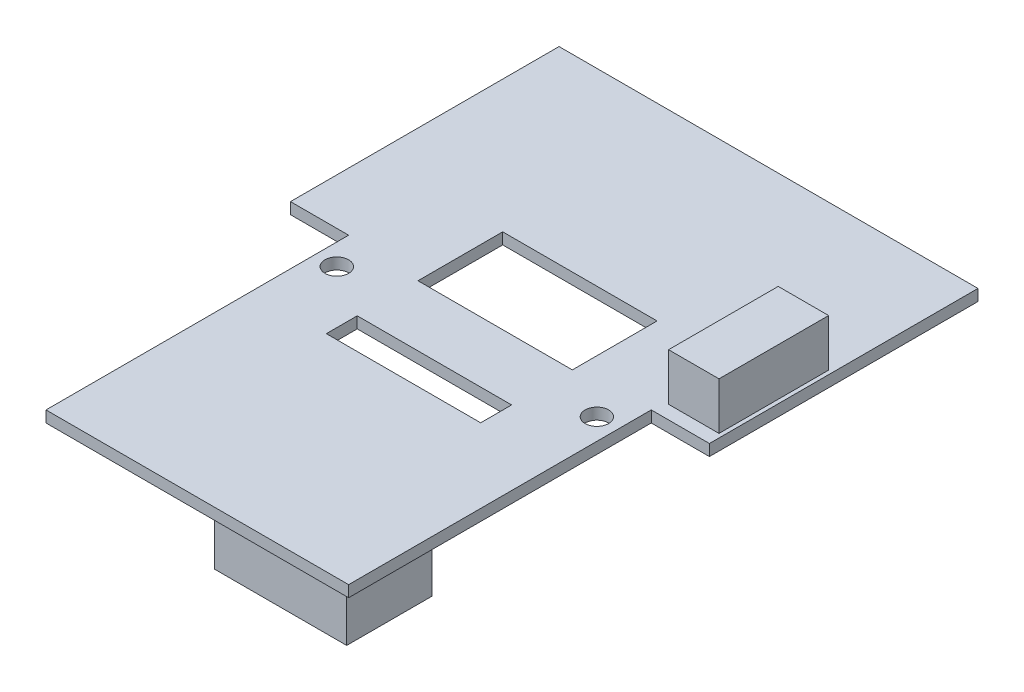
ISO-10303-21;
HEADER;
FILE_DESCRIPTION(('STEP AP214'),'2;1');
FILE_NAME('part.step','',(''),(''),'','','');
FILE_SCHEMA(('AUTOMOTIVE_DESIGN { 1 0 10303 214 1 1 1 1 }'));
ENDSEC;
DATA;
#1=APPLICATION_CONTEXT('core data for automotive mechanical design processes');
#2=APPLICATION_PROTOCOL_DEFINITION('international standard','automotive_design',2000,#1);
#3=PRODUCT_CONTEXT('',#1,'mechanical');
#4=PRODUCT('Part','Part','',(#3));
#5=PRODUCT_RELATED_PRODUCT_CATEGORY('part','',(#4));
#6=PRODUCT_DEFINITION_FORMATION('','',#4);
#7=PRODUCT_DEFINITION_CONTEXT('part definition',#1,'design');
#8=PRODUCT_DEFINITION('design','',#6,#7);
#9=PRODUCT_DEFINITION_SHAPE('','',#8);
#10=(LENGTH_UNIT() NAMED_UNIT(*) SI_UNIT(.MILLI.,.METRE.));
#11=(NAMED_UNIT(*) PLANE_ANGLE_UNIT() SI_UNIT($,.RADIAN.));
#12=(NAMED_UNIT(*) SI_UNIT($,.STERADIAN.) SOLID_ANGLE_UNIT());
#13=UNCERTAINTY_MEASURE_WITH_UNIT(LENGTH_MEASURE(1.E-05),#10,'distance_accuracy_value','');
#14=(GEOMETRIC_REPRESENTATION_CONTEXT(3) GLOBAL_UNCERTAINTY_ASSIGNED_CONTEXT((#13)) GLOBAL_UNIT_ASSIGNED_CONTEXT((#10,
#11,#12)) REPRESENTATION_CONTEXT('',''));
#15=CARTESIAN_POINT('',(0.,0.,0.));
#16=DIRECTION('',(0.,0.,1.));
#17=DIRECTION('',(1.,0.,0.));
#18=AXIS2_PLACEMENT_3D('',#15,#16,#17);
#19=CARTESIAN_POINT('',(0.,0.,0.));
#20=DIRECTION('',(0.,1.,0.));
#21=DIRECTION('',(0.,0.,1.));
#22=AXIS2_PLACEMENT_3D('',#19,#20,#21);
#23=PLANE('',#22);
#24=DIRECTION('',(0.,0.,-1.));
#25=VECTOR('',#24,1.);
#26=CARTESIAN_POINT('',(8.1617709908932,0.,10.197662603142));
#27=LINE('',#26,#25);
#28=CARTESIAN_POINT('',(8.1617709908932,0.,10.197662603142));
#29=VERTEX_POINT('',#28);
#30=CARTESIAN_POINT('',(8.1617709908932,0.,6.92782580708154));
#31=VERTEX_POINT('',#30);
#32=EDGE_CURVE('E251',#29,#31,#27,.T.);
#33=ORIENTED_EDGE('',*,*,#32,.T.);
#34=DIRECTION('',(-1.,0.,0.));
#35=VECTOR('',#34,1.);
#36=CARTESIAN_POINT('',(-8.1617709908932,0.,6.92782580708154));
#37=LINE('',#36,#35);
#38=CARTESIAN_POINT('',(-8.1617709908932,0.,6.92782580708154));
#39=VERTEX_POINT('',#38);
#40=EDGE_CURVE('E265',#31,#39,#37,.T.);
#41=ORIENTED_EDGE('',*,*,#40,.T.);
#42=DIRECTION('',(0.,0.,1.));
#43=VECTOR('',#42,1.);
#44=CARTESIAN_POINT('',(-8.1617709908932,0.,10.197662603142));
#45=LINE('',#44,#43);
#46=CARTESIAN_POINT('',(-8.1617709908932,0.,10.197662603142));
#47=VERTEX_POINT('',#46);
#48=EDGE_CURVE('E268',#39,#47,#45,.T.);
#49=ORIENTED_EDGE('',*,*,#48,.T.);
#50=DIRECTION('',(1.,0.,0.));
#51=VECTOR('',#50,1.);
#52=CARTESIAN_POINT('',(-8.1617709908932,0.,10.197662603142));
#53=LINE('',#52,#51);
#54=EDGE_CURVE('E255',#47,#29,#53,.T.);
#55=ORIENTED_EDGE('',*,*,#54,.T.);
#56=EDGE_LOOP('',(#33,#41,#49,#55));
#57=FACE_BOUND('',#56,.T.);
#58=CARTESIAN_POINT('',(-13.75,0.,3.5));
#59=DIRECTION('',(0.,1.,0.));
#60=DIRECTION('',(0.,0.,-1.));
#61=AXIS2_PLACEMENT_3D('',#58,#59,#60);
#62=CIRCLE('',#61,1.25);
#63=CARTESIAN_POINT('',(-13.75,0.,2.25));
#64=VERTEX_POINT('',#63);
#65=EDGE_CURVE('E313',#64,#64,#62,.T.);
#66=ORIENTED_EDGE('',*,*,#65,.T.);
#67=EDGE_LOOP('',(#66));
#68=FACE_BOUND('',#67,.T.);
#69=CARTESIAN_POINT('',(13.75,0.,3.5));
#70=DIRECTION('',(0.,1.,0.));
#71=DIRECTION('',(0.,0.,1.));
#72=AXIS2_PLACEMENT_3D('',#69,#70,#71);
#73=CIRCLE('',#72,1.25);
#74=CARTESIAN_POINT('',(13.75,0.,4.75));
#75=VERTEX_POINT('',#74);
#76=EDGE_CURVE('E317',#75,#75,#73,.T.);
#77=ORIENTED_EDGE('',*,*,#76,.T.);
#78=EDGE_LOOP('',(#77));
#79=FACE_BOUND('',#78,.T.);
#80=DIRECTION('',(1.,0.,0.));
#81=VECTOR('',#80,1.);
#82=CARTESIAN_POINT('',(16.,0.,0.));
#83=LINE('',#82,#81);
#84=CARTESIAN_POINT('',(16.,0.,0.));
#85=VERTEX_POINT('',#84);
#86=CARTESIAN_POINT('',(22.15,0.,0.));
#87=VERTEX_POINT('',#86);
#88=EDGE_CURVE('E323',#85,#87,#83,.T.);
#89=ORIENTED_EDGE('',*,*,#88,.F.);
#90=DIRECTION('',(0.,0.,-1.));
#91=VECTOR('',#90,1.);
#92=CARTESIAN_POINT('',(16.,0.,0.));
#93=LINE('',#92,#91);
#94=CARTESIAN_POINT('',(16.,0.,32.));
#95=VERTEX_POINT('',#94);
#96=EDGE_CURVE('E330',#95,#85,#93,.T.);
#97=ORIENTED_EDGE('',*,*,#96,.F.);
#98=DIRECTION('',(1.,0.,0.));
#99=VECTOR('',#98,1.);
#100=CARTESIAN_POINT('',(16.,0.,32.));
#101=LINE('',#100,#99);
#102=CARTESIAN_POINT('',(-16.,0.,32.));
#103=VERTEX_POINT('',#102);
#104=EDGE_CURVE('E357',#103,#95,#101,.T.);
#105=ORIENTED_EDGE('',*,*,#104,.F.);
#106=DIRECTION('',(0.,0.,1.));
#107=VECTOR('',#106,1.);
#108=CARTESIAN_POINT('',(-16.,0.,0.));
#109=LINE('',#108,#107);
#110=CARTESIAN_POINT('',(-16.,0.,0.));
#111=VERTEX_POINT('',#110);
#112=EDGE_CURVE('E355',#111,#103,#109,.T.);
#113=ORIENTED_EDGE('',*,*,#112,.F.);
#114=DIRECTION('',(1.,0.,0.));
#115=VECTOR('',#114,1.);
#116=CARTESIAN_POINT('',(-16.,0.,0.));
#117=LINE('',#116,#115);
#118=CARTESIAN_POINT('',(-22.15,0.,0.));
#119=VERTEX_POINT('',#118);
#120=EDGE_CURVE('E353',#119,#111,#117,.T.);
#121=ORIENTED_EDGE('',*,*,#120,.F.);
#122=DIRECTION('',(0.,0.,1.));
#123=VECTOR('',#122,1.);
#124=CARTESIAN_POINT('',(-22.15,0.,0.));
#125=LINE('',#124,#123);
#126=CARTESIAN_POINT('',(-22.15,0.,-28.4));
#127=VERTEX_POINT('',#126);
#128=EDGE_CURVE('E351',#127,#119,#125,.T.);
#129=ORIENTED_EDGE('',*,*,#128,.F.);
#130=DIRECTION('',(-1.,0.,0.));
#131=VECTOR('',#130,1.);
#132=CARTESIAN_POINT('',(22.15,0.,-28.4));
#133=LINE('',#132,#131);
#134=CARTESIAN_POINT('',(22.15,0.,-28.4));
#135=VERTEX_POINT('',#134);
#136=EDGE_CURVE('E349',#135,#127,#133,.T.);
#137=ORIENTED_EDGE('',*,*,#136,.F.);
#138=DIRECTION('',(0.,0.,-1.));
#139=VECTOR('',#138,1.);
#140=CARTESIAN_POINT('',(22.15,0.,0.));
#141=LINE('',#140,#139);
#142=EDGE_CURVE('E347',#87,#135,#141,.T.);
#143=ORIENTED_EDGE('',*,*,#142,.F.);
#144=EDGE_LOOP('',(#89,#97,#105,#113,#121,#129,#137,#143));
#145=FACE_BOUND('',#144,.T.);
#146=DIRECTION('',(0.,0.,-1.));
#147=VECTOR('',#146,1.);
#148=CARTESIAN_POINT('',(8.1617709908932,0.,-8.45453190067537));
#149=LINE('',#148,#147);
#150=CARTESIAN_POINT('',(8.1617709908932,0.,0.506724084832735));
#151=VERTEX_POINT('',#150);
#152=CARTESIAN_POINT('',(8.1617709908932,0.,-8.45453190067537));
#153=VERTEX_POINT('',#152);
#154=EDGE_CURVE('E282',#151,#153,#149,.T.);
#155=ORIENTED_EDGE('',*,*,#154,.T.);
#156=DIRECTION('',(-1.,0.,0.));
#157=VECTOR('',#156,1.);
#158=CARTESIAN_POINT('',(-8.1617709908932,0.,-8.45453190067537));
#159=LINE('',#158,#157);
#160=CARTESIAN_POINT('',(-8.1617709908932,0.,-8.45453190067537));
#161=VERTEX_POINT('',#160);
#162=EDGE_CURVE('E296',#153,#161,#159,.T.);
#163=ORIENTED_EDGE('',*,*,#162,.T.);
#164=DIRECTION('',(0.,0.,1.));
#165=VECTOR('',#164,1.);
#166=CARTESIAN_POINT('',(-8.1617709908932,0.,-8.45453190067537));
#167=LINE('',#166,#165);
#168=CARTESIAN_POINT('',(-8.1617709908932,0.,0.506724084832735));
#169=VERTEX_POINT('',#168);
#170=EDGE_CURVE('E299',#161,#169,#167,.T.);
#171=ORIENTED_EDGE('',*,*,#170,.T.);
#172=DIRECTION('',(1.,0.,0.));
#173=VECTOR('',#172,1.);
#174=CARTESIAN_POINT('',(-8.1617709908932,0.,0.506724084832735));
#175=LINE('',#174,#173);
#176=EDGE_CURVE('E286',#169,#151,#175,.T.);
#177=ORIENTED_EDGE('',*,*,#176,.T.);
#178=EDGE_LOOP('',(#155,#163,#171,#177));
#179=FACE_BOUND('',#178,.T.);
#180=DIRECTION('',(0.,0.,1.));
#181=VECTOR('',#180,1.);
#182=CARTESIAN_POINT('',(15.2674785800794,0.,31.4727245008637));
#183=LINE('',#182,#181);
#184=CARTESIAN_POINT('',(15.2674785800794,0.,22.4727245008637));
#185=VERTEX_POINT('',#184);
#186=CARTESIAN_POINT('',(15.2674785800794,0.,31.4727245008637));
#187=VERTEX_POINT('',#186);
#188=EDGE_CURVE('E216',#185,#187,#183,.T.);
#189=ORIENTED_EDGE('',*,*,#188,.F.);
#190=DIRECTION('',(1.,0.,0.));
#191=VECTOR('',#190,1.);
#192=CARTESIAN_POINT('',(15.2674785800794,0.,22.4727245008637));
#193=LINE('',#192,#191);
#194=CARTESIAN_POINT('',(1.26747858007938,0.,22.4727245008637));
#195=VERTEX_POINT('',#194);
#196=EDGE_CURVE('E213',#195,#185,#193,.T.);
#197=ORIENTED_EDGE('',*,*,#196,.F.);
#198=DIRECTION('',(0.,0.,-1.));
#199=VECTOR('',#198,1.);
#200=CARTESIAN_POINT('',(1.26747858007938,0.,31.4727245008637));
#201=LINE('',#200,#199);
#202=CARTESIAN_POINT('',(1.26747858007938,0.,31.4727245008637));
#203=VERTEX_POINT('',#202);
#204=EDGE_CURVE('E55',#203,#195,#201,.T.);
#205=ORIENTED_EDGE('',*,*,#204,.F.);
#206=DIRECTION('',(-1.,0.,0.));
#207=VECTOR('',#206,1.);
#208=CARTESIAN_POINT('',(15.2674785800794,0.,31.4727245008637));
#209=LINE('',#208,#207);
#210=EDGE_CURVE('E50',#187,#203,#209,.T.);
#211=ORIENTED_EDGE('',*,*,#210,.F.);
#212=EDGE_LOOP('',(#189,#197,#205,#211));
#213=FACE_BOUND('',#212,.T.);
#214=ADVANCED_FACE('F35',(#57,#68,#79,#145,#179,#213),#23,.F.);
#215=CARTESIAN_POINT('',(0.,1.2,0.));
#216=DIRECTION('',(0.,1.,0.));
#217=DIRECTION('',(0.,0.,1.));
#218=AXIS2_PLACEMENT_3D('',#215,#216,#217);
#219=PLANE('',#218);
#220=CARTESIAN_POINT('',(13.75,1.2,3.5));
#221=DIRECTION('',(0.,1.,0.));
#222=DIRECTION('',(0.,0.,1.));
#223=AXIS2_PLACEMENT_3D('',#220,#221,#222);
#224=CIRCLE('',#223,1.25);
#225=CARTESIAN_POINT('',(13.75,1.2,4.75));
#226=VERTEX_POINT('',#225);
#227=EDGE_CURVE('E320',#226,#226,#224,.T.);
#228=ORIENTED_EDGE('',*,*,#227,.F.);
#229=EDGE_LOOP('',(#228));
#230=FACE_BOUND('',#229,.T.);
#231=DIRECTION('',(1.,0.,0.));
#232=VECTOR('',#231,1.);
#233=CARTESIAN_POINT('',(16.,1.2,0.));
#234=LINE('',#233,#232);
#235=CARTESIAN_POINT('',(16.,1.2,0.));
#236=VERTEX_POINT('',#235);
#237=CARTESIAN_POINT('',(22.15,1.2,0.));
#238=VERTEX_POINT('',#237);
#239=EDGE_CURVE('E326',#236,#238,#234,.T.);
#240=ORIENTED_EDGE('',*,*,#239,.T.);
#241=DIRECTION('',(0.,0.,-1.));
#242=VECTOR('',#241,1.);
#243=CARTESIAN_POINT('',(22.15,1.2,0.));
#244=LINE('',#243,#242);
#245=CARTESIAN_POINT('',(22.15,1.2,-28.4));
#246=VERTEX_POINT('',#245);
#247=EDGE_CURVE('E329',#238,#246,#244,.T.);
#248=ORIENTED_EDGE('',*,*,#247,.T.);
#249=DIRECTION('',(-1.,0.,0.));
#250=VECTOR('',#249,1.);
#251=CARTESIAN_POINT('',(22.15,1.2,-28.4));
#252=LINE('',#251,#250);
#253=CARTESIAN_POINT('',(-22.15,1.2,-28.4));
#254=VERTEX_POINT('',#253);
#255=EDGE_CURVE('E332',#246,#254,#252,.T.);
#256=ORIENTED_EDGE('',*,*,#255,.T.);
#257=DIRECTION('',(0.,0.,1.));
#258=VECTOR('',#257,1.);
#259=CARTESIAN_POINT('',(-22.15,1.2,0.));
#260=LINE('',#259,#258);
#261=CARTESIAN_POINT('',(-22.15,1.2,0.));
#262=VERTEX_POINT('',#261);
#263=EDGE_CURVE('E334',#254,#262,#260,.T.);
#264=ORIENTED_EDGE('',*,*,#263,.T.);
#265=DIRECTION('',(1.,0.,0.));
#266=VECTOR('',#265,1.);
#267=CARTESIAN_POINT('',(-16.,1.2,0.));
#268=LINE('',#267,#266);
#269=CARTESIAN_POINT('',(-16.,1.2,0.));
#270=VERTEX_POINT('',#269);
#271=EDGE_CURVE('E336',#262,#270,#268,.T.);
#272=ORIENTED_EDGE('',*,*,#271,.T.);
#273=DIRECTION('',(0.,0.,1.));
#274=VECTOR('',#273,1.);
#275=CARTESIAN_POINT('',(-16.,1.2,0.));
#276=LINE('',#275,#274);
#277=CARTESIAN_POINT('',(-16.,1.2,32.));
#278=VERTEX_POINT('',#277);
#279=EDGE_CURVE('E338',#270,#278,#276,.T.);
#280=ORIENTED_EDGE('',*,*,#279,.T.);
#281=DIRECTION('',(1.,0.,0.));
#282=VECTOR('',#281,1.);
#283=CARTESIAN_POINT('',(16.,1.2,32.));
#284=LINE('',#283,#282);
#285=CARTESIAN_POINT('',(16.,1.2,32.));
#286=VERTEX_POINT('',#285);
#287=EDGE_CURVE('E340',#278,#286,#284,.T.);
#288=ORIENTED_EDGE('',*,*,#287,.T.);
#289=DIRECTION('',(0.,0.,-1.));
#290=VECTOR('',#289,1.);
#291=CARTESIAN_POINT('',(16.,1.2,0.));
#292=LINE('',#291,#290);
#293=EDGE_CURVE('E342',#286,#236,#292,.T.);
#294=ORIENTED_EDGE('',*,*,#293,.T.);
#295=EDGE_LOOP('',(#240,#248,#256,#264,#272,#280,#288,#294));
#296=FACE_BOUND('',#295,.T.);
#297=CARTESIAN_POINT('',(-13.75,1.2,3.5));
#298=DIRECTION('',(0.,1.,0.));
#299=DIRECTION('',(0.,0.,-1.));
#300=AXIS2_PLACEMENT_3D('',#297,#298,#299);
#301=CIRCLE('',#300,1.25);
#302=CARTESIAN_POINT('',(-13.75,1.2,2.25));
#303=VERTEX_POINT('',#302);
#304=EDGE_CURVE('E314',#303,#303,#301,.T.);
#305=ORIENTED_EDGE('',*,*,#304,.F.);
#306=EDGE_LOOP('',(#305));
#307=FACE_BOUND('',#306,.T.);
#308=DIRECTION('',(-1.,0.,0.));
#309=VECTOR('',#308,1.);
#310=CARTESIAN_POINT('',(-8.1617709908932,1.2,-8.45453190067537));
#311=LINE('',#310,#309);
#312=CARTESIAN_POINT('',(8.1617709908932,1.2,-8.45453190067537));
#313=VERTEX_POINT('',#312);
#314=CARTESIAN_POINT('',(-8.1617709908932,1.2,-8.45453190067537));
#315=VERTEX_POINT('',#314);
#316=EDGE_CURVE('E285',#313,#315,#311,.T.);
#317=ORIENTED_EDGE('',*,*,#316,.F.);
#318=DIRECTION('',(0.,0.,-1.));
#319=VECTOR('',#318,1.);
#320=CARTESIAN_POINT('',(8.1617709908932,1.2,-8.45453190067537));
#321=LINE('',#320,#319);
#322=CARTESIAN_POINT('',(8.1617709908932,1.2,0.506724084832735));
#323=VERTEX_POINT('',#322);
#324=EDGE_CURVE('E283',#323,#313,#321,.T.);
#325=ORIENTED_EDGE('',*,*,#324,.F.);
#326=DIRECTION('',(1.,0.,0.));
#327=VECTOR('',#326,1.);
#328=CARTESIAN_POINT('',(-8.1617709908932,1.2,0.506724084832735));
#329=LINE('',#328,#327);
#330=CARTESIAN_POINT('',(-8.1617709908932,1.2,0.506724084832735));
#331=VERTEX_POINT('',#330);
#332=EDGE_CURVE('E291',#331,#323,#329,.T.);
#333=ORIENTED_EDGE('',*,*,#332,.F.);
#334=DIRECTION('',(0.,0.,1.));
#335=VECTOR('',#334,1.);
#336=CARTESIAN_POINT('',(-8.1617709908932,1.2,-8.45453190067537));
#337=LINE('',#336,#335);
#338=EDGE_CURVE('E288',#315,#331,#337,.T.);
#339=ORIENTED_EDGE('',*,*,#338,.F.);
#340=EDGE_LOOP('',(#317,#325,#333,#339));
#341=FACE_BOUND('',#340,.T.);
#342=DIRECTION('',(-1.,0.,0.));
#343=VECTOR('',#342,1.);
#344=CARTESIAN_POINT('',(-8.1617709908932,1.2,6.92782580708154));
#345=LINE('',#344,#343);
#346=CARTESIAN_POINT('',(8.1617709908932,1.2,6.92782580708154));
#347=VERTEX_POINT('',#346);
#348=CARTESIAN_POINT('',(-8.1617709908932,1.2,6.92782580708154));
#349=VERTEX_POINT('',#348);
#350=EDGE_CURVE('E254',#347,#349,#345,.T.);
#351=ORIENTED_EDGE('',*,*,#350,.F.);
#352=DIRECTION('',(0.,0.,-1.));
#353=VECTOR('',#352,1.);
#354=CARTESIAN_POINT('',(8.1617709908932,1.2,10.197662603142));
#355=LINE('',#354,#353);
#356=CARTESIAN_POINT('',(8.1617709908932,1.2,10.197662603142));
#357=VERTEX_POINT('',#356);
#358=EDGE_CURVE('E252',#357,#347,#355,.T.);
#359=ORIENTED_EDGE('',*,*,#358,.F.);
#360=DIRECTION('',(1.,0.,0.));
#361=VECTOR('',#360,1.);
#362=CARTESIAN_POINT('',(-8.1617709908932,1.2,10.197662603142));
#363=LINE('',#362,#361);
#364=CARTESIAN_POINT('',(-8.1617709908932,1.2,10.197662603142));
#365=VERTEX_POINT('',#364);
#366=EDGE_CURVE('E260',#365,#357,#363,.T.);
#367=ORIENTED_EDGE('',*,*,#366,.F.);
#368=DIRECTION('',(0.,0.,1.));
#369=VECTOR('',#368,1.);
#370=CARTESIAN_POINT('',(-8.1617709908932,1.2,10.197662603142));
#371=LINE('',#370,#369);
#372=EDGE_CURVE('E257',#349,#365,#371,.T.);
#373=ORIENTED_EDGE('',*,*,#372,.F.);
#374=EDGE_LOOP('',(#351,#359,#367,#373));
#375=FACE_BOUND('',#374,.T.);
#376=DIRECTION('',(-1.,0.,0.));
#377=VECTOR('',#376,1.);
#378=CARTESIAN_POINT('',(21.7356063624355,1.2,-13.0213233511586));
#379=LINE('',#378,#377);
#380=CARTESIAN_POINT('',(21.7356063624355,1.2,-13.0213233511586));
#381=VERTEX_POINT('',#380);
#382=CARTESIAN_POINT('',(16.4014631016043,1.2,-13.0213233511586));
#383=VERTEX_POINT('',#382);
#384=EDGE_CURVE('E220',#381,#383,#379,.T.);
#385=ORIENTED_EDGE('',*,*,#384,.F.);
#386=DIRECTION('',(0.,0.,-1.));
#387=VECTOR('',#386,1.);
#388=CARTESIAN_POINT('',(21.7356063624355,1.2,-1.42913796791444));
#389=LINE('',#388,#387);
#390=CARTESIAN_POINT('',(21.7356063624355,1.2,-1.42913796791444));
#391=VERTEX_POINT('',#390);
#392=EDGE_CURVE('E217',#391,#381,#389,.T.);
#393=ORIENTED_EDGE('',*,*,#392,.F.);
#394=DIRECTION('',(1.,0.,0.));
#395=VECTOR('',#394,1.);
#396=CARTESIAN_POINT('',(21.7356063624355,1.2,-1.42913796791444));
#397=LINE('',#396,#395);
#398=CARTESIAN_POINT('',(16.4014631016043,1.2,-1.42913796791444));
#399=VERTEX_POINT('',#398);
#400=EDGE_CURVE('E230',#399,#391,#397,.T.);
#401=ORIENTED_EDGE('',*,*,#400,.F.);
#402=DIRECTION('',(0.,0.,1.));
#403=VECTOR('',#402,1.);
#404=CARTESIAN_POINT('',(16.4014631016043,1.2,-1.42913796791444));
#405=LINE('',#404,#403);
#406=EDGE_CURVE('E238',#383,#399,#405,.T.);
#407=ORIENTED_EDGE('',*,*,#406,.F.);
#408=EDGE_LOOP('',(#385,#393,#401,#407));
#409=FACE_BOUND('',#408,.T.);
#410=ADVANCED_FACE('F400',(#230,#296,#307,#341,#375,#409),#219,.T.);
#411=CARTESIAN_POINT('',(16.,1.2,0.));
#412=DIRECTION('',(0.,0.,-1.));
#413=DIRECTION('',(-1.,0.,0.));
#414=AXIS2_PLACEMENT_3D('',#411,#412,#413);
#415=PLANE('',#414);
#416=ORIENTED_EDGE('',*,*,#88,.T.);
#417=DIRECTION('',(0.,-1.,0.));
#418=VECTOR('',#417,1.);
#419=CARTESIAN_POINT('',(22.15,1.2,0.));
#420=LINE('',#419,#418);
#421=EDGE_CURVE('E11',#238,#87,#420,.T.);
#422=ORIENTED_EDGE('',*,*,#421,.F.);
#423=ORIENTED_EDGE('',*,*,#239,.F.);
#424=DIRECTION('',(0.,-1.,0.));
#425=VECTOR('',#424,1.);
#426=CARTESIAN_POINT('',(16.,1.2,0.));
#427=LINE('',#426,#425);
#428=EDGE_CURVE('E344',#236,#85,#427,.T.);
#429=ORIENTED_EDGE('',*,*,#428,.T.);
#430=EDGE_LOOP('',(#416,#422,#423,#429));
#431=FACE_BOUND('',#430,.T.);
#432=ADVANCED_FACE('F37',(#431),#415,.F.);
#433=CARTESIAN_POINT('',(22.15,1.2,0.));
#434=DIRECTION('',(-1.,0.,0.));
#435=DIRECTION('',(0.,0.,1.));
#436=AXIS2_PLACEMENT_3D('',#433,#434,#435);
#437=PLANE('',#436);
#438=ORIENTED_EDGE('',*,*,#142,.T.);
#439=DIRECTION('',(0.,-1.,0.));
#440=VECTOR('',#439,1.);
#441=CARTESIAN_POINT('',(22.15,1.2,-28.4));
#442=LINE('',#441,#440);
#443=EDGE_CURVE('E43',#246,#135,#442,.T.);
#444=ORIENTED_EDGE('',*,*,#443,.F.);
#445=ORIENTED_EDGE('',*,*,#247,.F.);
#446=ORIENTED_EDGE('',*,*,#421,.T.);
#447=EDGE_LOOP('',(#438,#444,#445,#446));
#448=FACE_BOUND('',#447,.T.);
#449=ADVANCED_FACE('F405',(#448),#437,.F.);
#450=CARTESIAN_POINT('',(22.15,1.2,-28.4));
#451=DIRECTION('',(0.,0.,1.));
#452=DIRECTION('',(1.,0.,0.));
#453=AXIS2_PLACEMENT_3D('',#450,#451,#452);
#454=PLANE('',#453);
#455=ORIENTED_EDGE('',*,*,#136,.T.);
#456=DIRECTION('',(0.,-1.,0.));
#457=VECTOR('',#456,1.);
#458=CARTESIAN_POINT('',(-22.15,1.2,-28.4));
#459=LINE('',#458,#457);
#460=EDGE_CURVE('E374',#254,#127,#459,.T.);
#461=ORIENTED_EDGE('',*,*,#460,.F.);
#462=ORIENTED_EDGE('',*,*,#255,.F.);
#463=ORIENTED_EDGE('',*,*,#443,.T.);
#464=EDGE_LOOP('',(#455,#461,#462,#463));
#465=FACE_BOUND('',#464,.T.);
#466=ADVANCED_FACE('F381',(#465),#454,.F.);
#467=CARTESIAN_POINT('',(-22.15,1.2,0.));
#468=DIRECTION('',(1.,0.,0.));
#469=DIRECTION('',(0.,0.,-1.));
#470=AXIS2_PLACEMENT_3D('',#467,#468,#469);
#471=PLANE('',#470);
#472=ORIENTED_EDGE('',*,*,#128,.T.);
#473=DIRECTION('',(0.,-1.,0.));
#474=VECTOR('',#473,1.);
#475=CARTESIAN_POINT('',(-22.15,1.2,0.));
#476=LINE('',#475,#474);
#477=EDGE_CURVE('E371',#262,#119,#476,.T.);
#478=ORIENTED_EDGE('',*,*,#477,.F.);
#479=ORIENTED_EDGE('',*,*,#263,.F.);
#480=ORIENTED_EDGE('',*,*,#460,.T.);
#481=EDGE_LOOP('',(#472,#478,#479,#480));
#482=FACE_BOUND('',#481,.T.);
#483=ADVANCED_FACE('F392',(#482),#471,.F.);
#484=CARTESIAN_POINT('',(-16.,1.2,0.));
#485=DIRECTION('',(0.,0.,-1.));
#486=DIRECTION('',(-1.,0.,0.));
#487=AXIS2_PLACEMENT_3D('',#484,#485,#486);
#488=PLANE('',#487);
#489=ORIENTED_EDGE('',*,*,#120,.T.);
#490=DIRECTION('',(0.,-1.,0.));
#491=VECTOR('',#490,1.);
#492=CARTESIAN_POINT('',(-16.,1.2,0.));
#493=LINE('',#492,#491);
#494=EDGE_CURVE('E368',#270,#111,#493,.T.);
#495=ORIENTED_EDGE('',*,*,#494,.F.);
#496=ORIENTED_EDGE('',*,*,#271,.F.);
#497=ORIENTED_EDGE('',*,*,#477,.T.);
#498=EDGE_LOOP('',(#489,#495,#496,#497));
#499=FACE_BOUND('',#498,.T.);
#500=ADVANCED_FACE('F396',(#499),#488,.F.);
#501=CARTESIAN_POINT('',(-16.,1.2,0.));
#502=DIRECTION('',(1.,0.,0.));
#503=DIRECTION('',(0.,0.,-1.));
#504=AXIS2_PLACEMENT_3D('',#501,#502,#503);
#505=PLANE('',#504);
#506=ORIENTED_EDGE('',*,*,#112,.T.);
#507=DIRECTION('',(0.,-1.,0.));
#508=VECTOR('',#507,1.);
#509=CARTESIAN_POINT('',(-16.,1.2,32.));
#510=LINE('',#509,#508);
#511=EDGE_CURVE('E365',#278,#103,#510,.T.);
#512=ORIENTED_EDGE('',*,*,#511,.F.);
#513=ORIENTED_EDGE('',*,*,#279,.F.);
#514=ORIENTED_EDGE('',*,*,#494,.T.);
#515=EDGE_LOOP('',(#506,#512,#513,#514));
#516=FACE_BOUND('',#515,.T.);
#517=ADVANCED_FACE('F418',(#516),#505,.F.);
#518=CARTESIAN_POINT('',(16.,1.2,32.));
#519=DIRECTION('',(0.,0.,-1.));
#520=DIRECTION('',(-1.,0.,0.));
#521=AXIS2_PLACEMENT_3D('',#518,#519,#520);
#522=PLANE('',#521);
#523=ORIENTED_EDGE('',*,*,#104,.T.);
#524=DIRECTION('',(0.,-1.,0.));
#525=VECTOR('',#524,1.);
#526=CARTESIAN_POINT('',(16.,1.2,32.));
#527=LINE('',#526,#525);
#528=EDGE_CURVE('E362',#286,#95,#527,.T.);
#529=ORIENTED_EDGE('',*,*,#528,.F.);
#530=ORIENTED_EDGE('',*,*,#287,.F.);
#531=ORIENTED_EDGE('',*,*,#511,.T.);
#532=EDGE_LOOP('',(#523,#529,#530,#531));
#533=FACE_BOUND('',#532,.T.);
#534=ADVANCED_FACE('F416',(#533),#522,.F.);
#535=CARTESIAN_POINT('',(16.,1.2,0.));
#536=DIRECTION('',(-1.,0.,0.));
#537=DIRECTION('',(0.,0.,1.));
#538=AXIS2_PLACEMENT_3D('',#535,#536,#537);
#539=PLANE('',#538);
#540=ORIENTED_EDGE('',*,*,#96,.T.);
#541=ORIENTED_EDGE('',*,*,#428,.F.);
#542=ORIENTED_EDGE('',*,*,#293,.F.);
#543=ORIENTED_EDGE('',*,*,#528,.T.);
#544=EDGE_LOOP('',(#540,#541,#542,#543));
#545=FACE_BOUND('',#544,.T.);
#546=ADVANCED_FACE('F411',(#545),#539,.F.);
#547=CARTESIAN_POINT('',(13.75,1.2,3.5));
#548=DIRECTION('',(0.,-1.,0.));
#549=DIRECTION('',(0.,0.,-1.));
#550=AXIS2_PLACEMENT_3D('',#547,#548,#549);
#551=CYLINDRICAL_SURFACE('',#550,1.25);
#552=ORIENTED_EDGE('',*,*,#227,.T.);
#553=EDGE_LOOP('',(#552));
#554=FACE_BOUND('',#553,.T.);
#555=ORIENTED_EDGE('',*,*,#76,.F.);
#556=EDGE_LOOP('',(#555));
#557=FACE_BOUND('',#556,.T.);
#558=ADVANCED_FACE('F441',(#554,#557),#551,.F.);
#559=CARTESIAN_POINT('',(-13.75,1.2,3.5));
#560=DIRECTION('',(0.,-1.,0.));
#561=DIRECTION('',(0.,0.,-1.));
#562=AXIS2_PLACEMENT_3D('',#559,#560,#561);
#563=CYLINDRICAL_SURFACE('',#562,1.25);
#564=ORIENTED_EDGE('',*,*,#304,.T.);
#565=EDGE_LOOP('',(#564));
#566=FACE_BOUND('',#565,.T.);
#567=ORIENTED_EDGE('',*,*,#65,.F.);
#568=EDGE_LOOP('',(#567));
#569=FACE_BOUND('',#568,.T.);
#570=ADVANCED_FACE('F445',(#566,#569),#563,.F.);
#571=CARTESIAN_POINT('',(8.1617709908932,1.2,-8.45453190067537));
#572=DIRECTION('',(-1.,0.,0.));
#573=DIRECTION('',(0.,0.,1.));
#574=AXIS2_PLACEMENT_3D('',#571,#572,#573);
#575=PLANE('',#574);
#576=ORIENTED_EDGE('',*,*,#154,.F.);
#577=DIRECTION('',(0.,-1.,0.));
#578=VECTOR('',#577,1.);
#579=CARTESIAN_POINT('',(8.1617709908932,1.2,0.506724084832735));
#580=LINE('',#579,#578);
#581=EDGE_CURVE('E293',#323,#151,#580,.T.);
#582=ORIENTED_EDGE('',*,*,#581,.F.);
#583=ORIENTED_EDGE('',*,*,#324,.T.);
#584=DIRECTION('',(0.,-1.,0.));
#585=VECTOR('',#584,1.);
#586=CARTESIAN_POINT('',(8.1617709908932,1.2,-8.45453190067537));
#587=LINE('',#586,#585);
#588=EDGE_CURVE('E310',#313,#153,#587,.T.);
#589=ORIENTED_EDGE('',*,*,#588,.T.);
#590=EDGE_LOOP('',(#576,#582,#583,#589));
#591=FACE_BOUND('',#590,.T.);
#592=ADVANCED_FACE('F450',(#591),#575,.T.);
#593=CARTESIAN_POINT('',(-8.1617709908932,1.2,-8.45453190067537));
#594=DIRECTION('',(0.,0.,1.));
#595=DIRECTION('',(1.,0.,0.));
#596=AXIS2_PLACEMENT_3D('',#593,#594,#595);
#597=PLANE('',#596);
#598=ORIENTED_EDGE('',*,*,#162,.F.);
#599=ORIENTED_EDGE('',*,*,#588,.F.);
#600=ORIENTED_EDGE('',*,*,#316,.T.);
#601=DIRECTION('',(0.,-1.,0.));
#602=VECTOR('',#601,1.);
#603=CARTESIAN_POINT('',(-8.1617709908932,1.2,-8.45453190067537));
#604=LINE('',#603,#602);
#605=EDGE_CURVE('E308',#315,#161,#604,.T.);
#606=ORIENTED_EDGE('',*,*,#605,.T.);
#607=EDGE_LOOP('',(#598,#599,#600,#606));
#608=FACE_BOUND('',#607,.T.);
#609=ADVANCED_FACE('F457',(#608),#597,.T.);
#610=CARTESIAN_POINT('',(-8.1617709908932,1.2,-8.45453190067537));
#611=DIRECTION('',(1.,0.,0.));
#612=DIRECTION('',(0.,0.,-1.));
#613=AXIS2_PLACEMENT_3D('',#610,#611,#612);
#614=PLANE('',#613);
#615=ORIENTED_EDGE('',*,*,#170,.F.);
#616=ORIENTED_EDGE('',*,*,#605,.F.);
#617=ORIENTED_EDGE('',*,*,#338,.T.);
#618=DIRECTION('',(0.,-1.,0.));
#619=VECTOR('',#618,1.);
#620=CARTESIAN_POINT('',(-8.1617709908932,1.2,0.506724084832735));
#621=LINE('',#620,#619);
#622=EDGE_CURVE('E306',#331,#169,#621,.T.);
#623=ORIENTED_EDGE('',*,*,#622,.T.);
#624=EDGE_LOOP('',(#615,#616,#617,#623));
#625=FACE_BOUND('',#624,.T.);
#626=ADVANCED_FACE('F461',(#625),#614,.T.);
#627=CARTESIAN_POINT('',(-8.1617709908932,1.2,0.506724084832735));
#628=DIRECTION('',(0.,0.,-1.));
#629=DIRECTION('',(-1.,0.,0.));
#630=AXIS2_PLACEMENT_3D('',#627,#628,#629);
#631=PLANE('',#630);
#632=ORIENTED_EDGE('',*,*,#176,.F.);
#633=ORIENTED_EDGE('',*,*,#622,.F.);
#634=ORIENTED_EDGE('',*,*,#332,.T.);
#635=ORIENTED_EDGE('',*,*,#581,.T.);
#636=EDGE_LOOP('',(#632,#633,#634,#635));
#637=FACE_BOUND('',#636,.T.);
#638=ADVANCED_FACE('F465',(#637),#631,.T.);
#639=CARTESIAN_POINT('',(8.1617709908932,1.2,10.197662603142));
#640=DIRECTION('',(-1.,0.,0.));
#641=DIRECTION('',(0.,0.,1.));
#642=AXIS2_PLACEMENT_3D('',#639,#640,#641);
#643=PLANE('',#642);
#644=ORIENTED_EDGE('',*,*,#32,.F.);
#645=DIRECTION('',(0.,-1.,0.));
#646=VECTOR('',#645,1.);
#647=CARTESIAN_POINT('',(8.1617709908932,1.2,10.197662603142));
#648=LINE('',#647,#646);
#649=EDGE_CURVE('E262',#357,#29,#648,.T.);
#650=ORIENTED_EDGE('',*,*,#649,.F.);
#651=ORIENTED_EDGE('',*,*,#358,.T.);
#652=DIRECTION('',(0.,-1.,0.));
#653=VECTOR('',#652,1.);
#654=CARTESIAN_POINT('',(8.1617709908932,1.2,6.92782580708154));
#655=LINE('',#654,#653);
#656=EDGE_CURVE('E279',#347,#31,#655,.T.);
#657=ORIENTED_EDGE('',*,*,#656,.T.);
#658=EDGE_LOOP('',(#644,#650,#651,#657));
#659=FACE_BOUND('',#658,.T.);
#660=ADVANCED_FACE('F469',(#659),#643,.T.);
#661=CARTESIAN_POINT('',(-8.1617709908932,1.2,6.92782580708154));
#662=DIRECTION('',(0.,0.,1.));
#663=DIRECTION('',(1.,0.,0.));
#664=AXIS2_PLACEMENT_3D('',#661,#662,#663);
#665=PLANE('',#664);
#666=ORIENTED_EDGE('',*,*,#40,.F.);
#667=ORIENTED_EDGE('',*,*,#656,.F.);
#668=ORIENTED_EDGE('',*,*,#350,.T.);
#669=DIRECTION('',(0.,-1.,0.));
#670=VECTOR('',#669,1.);
#671=CARTESIAN_POINT('',(-8.1617709908932,1.2,6.92782580708154));
#672=LINE('',#671,#670);
#673=EDGE_CURVE('E277',#349,#39,#672,.T.);
#674=ORIENTED_EDGE('',*,*,#673,.T.);
#675=EDGE_LOOP('',(#666,#667,#668,#674));
#676=FACE_BOUND('',#675,.T.);
#677=ADVANCED_FACE('F473',(#676),#665,.T.);
#678=CARTESIAN_POINT('',(-8.1617709908932,1.2,10.197662603142));
#679=DIRECTION('',(1.,0.,0.));
#680=DIRECTION('',(0.,0.,-1.));
#681=AXIS2_PLACEMENT_3D('',#678,#679,#680);
#682=PLANE('',#681);
#683=ORIENTED_EDGE('',*,*,#48,.F.);
#684=ORIENTED_EDGE('',*,*,#673,.F.);
#685=ORIENTED_EDGE('',*,*,#372,.T.);
#686=DIRECTION('',(0.,-1.,0.));
#687=VECTOR('',#686,1.);
#688=CARTESIAN_POINT('',(-8.1617709908932,1.2,10.197662603142));
#689=LINE('',#688,#687);
#690=EDGE_CURVE('E275',#365,#47,#689,.T.);
#691=ORIENTED_EDGE('',*,*,#690,.T.);
#692=EDGE_LOOP('',(#683,#684,#685,#691));
#693=FACE_BOUND('',#692,.T.);
#694=ADVANCED_FACE('F477',(#693),#682,.T.);
#695=CARTESIAN_POINT('',(-8.1617709908932,1.2,10.197662603142));
#696=DIRECTION('',(0.,0.,-1.));
#697=DIRECTION('',(-1.,0.,0.));
#698=AXIS2_PLACEMENT_3D('',#695,#696,#697);
#699=PLANE('',#698);
#700=ORIENTED_EDGE('',*,*,#54,.F.);
#701=ORIENTED_EDGE('',*,*,#690,.F.);
#702=ORIENTED_EDGE('',*,*,#366,.T.);
#703=ORIENTED_EDGE('',*,*,#649,.T.);
#704=EDGE_LOOP('',(#700,#701,#702,#703));
#705=FACE_BOUND('',#704,.T.);
#706=ADVANCED_FACE('F481',(#705),#699,.T.);
#707=CARTESIAN_POINT('',(21.7356063624355,6.2,-1.42913796791444));
#708=DIRECTION('',(-1.,0.,0.));
#709=DIRECTION('',(0.,0.,1.));
#710=AXIS2_PLACEMENT_3D('',#707,#708,#709);
#711=PLANE('',#710);
#712=ORIENTED_EDGE('',*,*,#392,.T.);
#713=DIRECTION('',(0.,-1.,0.));
#714=VECTOR('',#713,1.);
#715=CARTESIAN_POINT('',(21.7356063624355,6.2,-13.0213233511586));
#716=LINE('',#715,#714);
#717=CARTESIAN_POINT('',(21.7356063624355,6.2,-13.0213233511586));
#718=VERTEX_POINT('',#717);
#719=EDGE_CURVE('E249',#718,#381,#716,.T.);
#720=ORIENTED_EDGE('',*,*,#719,.F.);
#721=DIRECTION('',(0.,0.,-1.));
#722=VECTOR('',#721,1.);
#723=CARTESIAN_POINT('',(21.7356063624355,6.2,-1.42913796791444));
#724=LINE('',#723,#722);
#725=CARTESIAN_POINT('',(21.7356063624355,6.2,-1.42913796791444));
#726=VERTEX_POINT('',#725);
#727=EDGE_CURVE('E226',#726,#718,#724,.T.);
#728=ORIENTED_EDGE('',*,*,#727,.F.);
#729=DIRECTION('',(0.,-1.,0.));
#730=VECTOR('',#729,1.);
#731=CARTESIAN_POINT('',(21.7356063624355,6.2,-1.42913796791444));
#732=LINE('',#731,#730);
#733=EDGE_CURVE('E235',#726,#391,#732,.T.);
#734=ORIENTED_EDGE('',*,*,#733,.T.);
#735=EDGE_LOOP('',(#712,#720,#728,#734));
#736=FACE_BOUND('',#735,.T.);
#737=ADVANCED_FACE('F485',(#736),#711,.F.);
#738=CARTESIAN_POINT('',(21.7356063624355,6.2,-13.0213233511586));
#739=DIRECTION('',(0.,0.,1.));
#740=DIRECTION('',(1.,0.,0.));
#741=AXIS2_PLACEMENT_3D('',#738,#739,#740);
#742=PLANE('',#741);
#743=ORIENTED_EDGE('',*,*,#384,.T.);
#744=DIRECTION('',(0.,-1.,0.));
#745=VECTOR('',#744,1.);
#746=CARTESIAN_POINT('',(16.4014631016043,6.2,-13.0213233511586));
#747=LINE('',#746,#745);
#748=CARTESIAN_POINT('',(16.4014631016043,6.2,-13.0213233511586));
#749=VERTEX_POINT('',#748);
#750=EDGE_CURVE('E246',#749,#383,#747,.T.);
#751=ORIENTED_EDGE('',*,*,#750,.F.);
#752=DIRECTION('',(-1.,0.,0.));
#753=VECTOR('',#752,1.);
#754=CARTESIAN_POINT('',(21.7356063624355,6.2,-13.0213233511586));
#755=LINE('',#754,#753);
#756=EDGE_CURVE('E229',#718,#749,#755,.T.);
#757=ORIENTED_EDGE('',*,*,#756,.F.);
#758=ORIENTED_EDGE('',*,*,#719,.T.);
#759=EDGE_LOOP('',(#743,#751,#757,#758));
#760=FACE_BOUND('',#759,.T.);
#761=ADVANCED_FACE('F489',(#760),#742,.F.);
#762=CARTESIAN_POINT('',(16.4014631016043,6.2,-1.42913796791444));
#763=DIRECTION('',(1.,0.,0.));
#764=DIRECTION('',(0.,0.,-1.));
#765=AXIS2_PLACEMENT_3D('',#762,#763,#764);
#766=PLANE('',#765);
#767=ORIENTED_EDGE('',*,*,#406,.T.);
#768=DIRECTION('',(0.,-1.,0.));
#769=VECTOR('',#768,1.);
#770=CARTESIAN_POINT('',(16.4014631016043,6.2,-1.42913796791444));
#771=LINE('',#770,#769);
#772=CARTESIAN_POINT('',(16.4014631016043,6.2,-1.42913796791444));
#773=VERTEX_POINT('',#772);
#774=EDGE_CURVE('E244',#773,#399,#771,.T.);
#775=ORIENTED_EDGE('',*,*,#774,.F.);
#776=DIRECTION('',(0.,0.,1.));
#777=VECTOR('',#776,1.);
#778=CARTESIAN_POINT('',(16.4014631016043,6.2,-1.42913796791444));
#779=LINE('',#778,#777);
#780=EDGE_CURVE('E232',#749,#773,#779,.T.);
#781=ORIENTED_EDGE('',*,*,#780,.F.);
#782=ORIENTED_EDGE('',*,*,#750,.T.);
#783=EDGE_LOOP('',(#767,#775,#781,#782));
#784=FACE_BOUND('',#783,.T.);
#785=ADVANCED_FACE('F493',(#784),#766,.F.);
#786=CARTESIAN_POINT('',(21.7356063624355,6.2,-1.42913796791444));
#787=DIRECTION('',(0.,0.,-1.));
#788=DIRECTION('',(-1.,0.,0.));
#789=AXIS2_PLACEMENT_3D('',#786,#787,#788);
#790=PLANE('',#789);
#791=ORIENTED_EDGE('',*,*,#400,.T.);
#792=ORIENTED_EDGE('',*,*,#733,.F.);
#793=DIRECTION('',(1.,0.,0.));
#794=VECTOR('',#793,1.);
#795=CARTESIAN_POINT('',(21.7356063624355,6.2,-1.42913796791444));
#796=LINE('',#795,#794);
#797=EDGE_CURVE('E234',#773,#726,#796,.T.);
#798=ORIENTED_EDGE('',*,*,#797,.F.);
#799=ORIENTED_EDGE('',*,*,#774,.T.);
#800=EDGE_LOOP('',(#791,#792,#798,#799));
#801=FACE_BOUND('',#800,.T.);
#802=ADVANCED_FACE('F497',(#801),#790,.F.);
#803=CARTESIAN_POINT('',(0.,6.2,0.));
#804=DIRECTION('',(0.,1.,0.));
#805=DIRECTION('',(0.,0.,1.));
#806=AXIS2_PLACEMENT_3D('',#803,#804,#805);
#807=PLANE('',#806);
#808=ORIENTED_EDGE('',*,*,#727,.T.);
#809=ORIENTED_EDGE('',*,*,#756,.T.);
#810=ORIENTED_EDGE('',*,*,#780,.T.);
#811=ORIENTED_EDGE('',*,*,#797,.T.);
#812=EDGE_LOOP('',(#808,#809,#810,#811));
#813=FACE_BOUND('',#812,.T.);
#814=ADVANCED_FACE('F501',(#813),#807,.T.);
#815=CARTESIAN_POINT('',(15.2674785800794,-5.,31.4727245008637));
#816=DIRECTION('',(-1.,0.,0.));
#817=DIRECTION('',(0.,0.,1.));
#818=AXIS2_PLACEMENT_3D('',#815,#816,#817);
#819=PLANE('',#818);
#820=ORIENTED_EDGE('',*,*,#188,.T.);
#821=DIRECTION('',(0.,1.,0.));
#822=VECTOR('',#821,1.);
#823=CARTESIAN_POINT('',(15.2674785800794,-5.,31.4727245008637));
#824=LINE('',#823,#822);
#825=CARTESIAN_POINT('',(15.2674785800794,-5.,31.4727245008637));
#826=VERTEX_POINT('',#825);
#827=EDGE_CURVE('E197',#826,#187,#824,.T.);
#828=ORIENTED_EDGE('',*,*,#827,.F.);
#829=DIRECTION('',(0.,0.,1.));
#830=VECTOR('',#829,1.);
#831=CARTESIAN_POINT('',(15.2674785800794,-5.,31.4727245008637));
#832=LINE('',#831,#830);
#833=CARTESIAN_POINT('',(15.2674785800794,-5.,22.4727245008637));
#834=VERTEX_POINT('',#833);
#835=EDGE_CURVE('E204',#834,#826,#832,.T.);
#836=ORIENTED_EDGE('',*,*,#835,.F.);
#837=DIRECTION('',(0.,1.,0.));
#838=VECTOR('',#837,1.);
#839=CARTESIAN_POINT('',(15.2674785800794,-5.,22.4727245008637));
#840=LINE('',#839,#838);
#841=EDGE_CURVE('E697',#834,#185,#840,.T.);
#842=ORIENTED_EDGE('',*,*,#841,.T.);
#843=EDGE_LOOP('',(#820,#828,#836,#842));
#844=FACE_BOUND('',#843,.T.);
#845=ADVANCED_FACE('F215',(#844),#819,.F.);
#846=CARTESIAN_POINT('',(15.2674785800794,-5.,31.4727245008637));
#847=DIRECTION('',(0.,0.,-1.));
#848=DIRECTION('',(-1.,0.,0.));
#849=AXIS2_PLACEMENT_3D('',#846,#847,#848);
#850=PLANE('',#849);
#851=ORIENTED_EDGE('',*,*,#210,.T.);
#852=DIRECTION('',(0.,1.,0.));
#853=VECTOR('',#852,1.);
#854=CARTESIAN_POINT('',(1.26747858007938,-5.,31.4727245008637));
#855=LINE('',#854,#853);
#856=CARTESIAN_POINT('',(1.26747858007938,-5.,31.4727245008637));
#857=VERTEX_POINT('',#856);
#858=EDGE_CURVE('E200',#857,#203,#855,.T.);
#859=ORIENTED_EDGE('',*,*,#858,.F.);
#860=DIRECTION('',(-1.,0.,0.));
#861=VECTOR('',#860,1.);
#862=CARTESIAN_POINT('',(15.2674785800794,-5.,31.4727245008637));
#863=LINE('',#862,#861);
#864=EDGE_CURVE('E193',#826,#857,#863,.T.);
#865=ORIENTED_EDGE('',*,*,#864,.F.);
#866=ORIENTED_EDGE('',*,*,#827,.T.);
#867=EDGE_LOOP('',(#851,#859,#865,#866));
#868=FACE_BOUND('',#867,.T.);
#869=ADVANCED_FACE('F195',(#868),#850,.F.);
#870=CARTESIAN_POINT('',(1.26747858007938,-5.,31.4727245008637));
#871=DIRECTION('',(1.,0.,0.));
#872=DIRECTION('',(0.,0.,-1.));
#873=AXIS2_PLACEMENT_3D('',#870,#871,#872);
#874=PLANE('',#873);
#875=ORIENTED_EDGE('',*,*,#204,.T.);
#876=DIRECTION('',(0.,1.,0.));
#877=VECTOR('',#876,1.);
#878=CARTESIAN_POINT('',(1.26747858007938,-5.,22.4727245008637));
#879=LINE('',#878,#877);
#880=CARTESIAN_POINT('',(1.26747858007938,-5.,22.4727245008637));
#881=VERTEX_POINT('',#880);
#882=EDGE_CURVE('E222',#881,#195,#879,.T.);
#883=ORIENTED_EDGE('',*,*,#882,.F.);
#884=DIRECTION('',(0.,0.,-1.));
#885=VECTOR('',#884,1.);
#886=CARTESIAN_POINT('',(1.26747858007938,-5.,31.4727245008637));
#887=LINE('',#886,#885);
#888=EDGE_CURVE('E203',#857,#881,#887,.T.);
#889=ORIENTED_EDGE('',*,*,#888,.F.);
#890=ORIENTED_EDGE('',*,*,#858,.T.);
#891=EDGE_LOOP('',(#875,#883,#889,#890));
#892=FACE_BOUND('',#891,.T.);
#893=ADVANCED_FACE('F510',(#892),#874,.F.);
#894=CARTESIAN_POINT('',(15.2674785800794,-5.,22.4727245008637));
#895=DIRECTION('',(0.,0.,1.));
#896=DIRECTION('',(1.,0.,0.));
#897=AXIS2_PLACEMENT_3D('',#894,#895,#896);
#898=PLANE('',#897);
#899=ORIENTED_EDGE('',*,*,#196,.T.);
#900=ORIENTED_EDGE('',*,*,#841,.F.);
#901=DIRECTION('',(1.,0.,0.));
#902=VECTOR('',#901,1.);
#903=CARTESIAN_POINT('',(15.2674785800794,-5.,22.4727245008637));
#904=LINE('',#903,#902);
#905=EDGE_CURVE('E209',#881,#834,#904,.T.);
#906=ORIENTED_EDGE('',*,*,#905,.F.);
#907=ORIENTED_EDGE('',*,*,#882,.T.);
#908=EDGE_LOOP('',(#899,#900,#906,#907));
#909=FACE_BOUND('',#908,.T.);
#910=ADVANCED_FACE('F513',(#909),#898,.F.);
#911=CARTESIAN_POINT('',(0.,-5.,0.));
#912=DIRECTION('',(0.,1.,0.));
#913=DIRECTION('',(0.,0.,1.));
#914=AXIS2_PLACEMENT_3D('',#911,#912,#913);
#915=PLANE('',#914);
#916=ORIENTED_EDGE('',*,*,#835,.T.);
#917=ORIENTED_EDGE('',*,*,#864,.T.);
#918=ORIENTED_EDGE('',*,*,#888,.T.);
#919=ORIENTED_EDGE('',*,*,#905,.T.);
#920=EDGE_LOOP('',(#916,#917,#918,#919));
#921=FACE_BOUND('',#920,.T.);
#922=ADVANCED_FACE('F207',(#921),#915,.F.);
#923=CLOSED_SHELL('',(#214,#410,#432,#449,#466,#483,#500,#517,#534,#546,#558,#570,#592,#609,
#626,#638,#660,#677,#694,#706,#737,#761,#785,#802,#814,#845,#869,#893,#910,#922));
#924=MANIFOLD_SOLID_BREP('B2',#923);
#925=ADVANCED_BREP_SHAPE_REPRESENTATION('',(#18,#924),#14);
#926=SHAPE_DEFINITION_REPRESENTATION(#9,#925);
ENDSEC;
END-ISO-10303-21;
